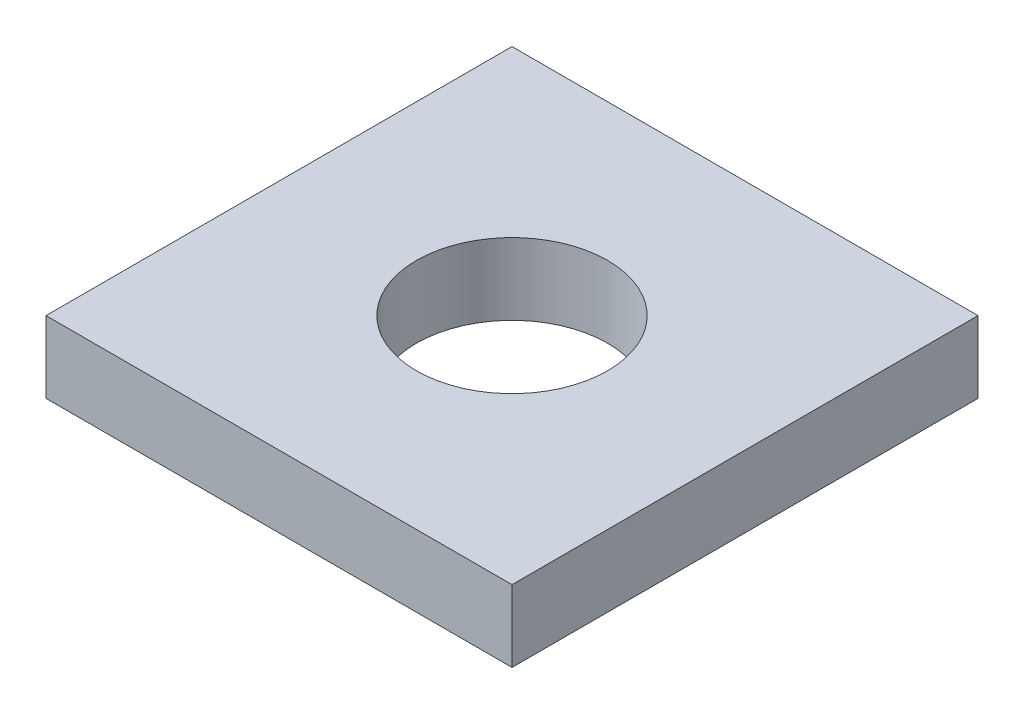
ISO-10303-21;
HEADER;
FILE_DESCRIPTION(('STEP AP214'),'2;1');
FILE_NAME('part.step','',(''),(''),'','','');
FILE_SCHEMA(('AUTOMOTIVE_DESIGN { 1 0 10303 214 1 1 1 1 }'));
ENDSEC;
DATA;
#1=APPLICATION_CONTEXT('core data for automotive mechanical design processes');
#2=APPLICATION_PROTOCOL_DEFINITION('international standard','automotive_design',2000,#1);
#3=PRODUCT_CONTEXT('',#1,'mechanical');
#4=PRODUCT('Part','Part','',(#3));
#5=PRODUCT_RELATED_PRODUCT_CATEGORY('part','',(#4));
#6=PRODUCT_DEFINITION_FORMATION('','',#4);
#7=PRODUCT_DEFINITION_CONTEXT('part definition',#1,'design');
#8=PRODUCT_DEFINITION('design','',#6,#7);
#9=PRODUCT_DEFINITION_SHAPE('','',#8);
#10=(LENGTH_UNIT() NAMED_UNIT(*) SI_UNIT(.MILLI.,.METRE.));
#11=(NAMED_UNIT(*) PLANE_ANGLE_UNIT() SI_UNIT($,.RADIAN.));
#12=(NAMED_UNIT(*) SI_UNIT($,.STERADIAN.) SOLID_ANGLE_UNIT());
#13=UNCERTAINTY_MEASURE_WITH_UNIT(LENGTH_MEASURE(1.E-05),#10,'distance_accuracy_value','');
#14=(GEOMETRIC_REPRESENTATION_CONTEXT(3) GLOBAL_UNCERTAINTY_ASSIGNED_CONTEXT((#13)) GLOBAL_UNIT_ASSIGNED_CONTEXT((#10,
#11,#12)) REPRESENTATION_CONTEXT('',''));
#15=CARTESIAN_POINT('',(0.,0.,0.));
#16=DIRECTION('',(0.,0.,1.));
#17=DIRECTION('',(1.,0.,0.));
#18=AXIS2_PLACEMENT_3D('',#15,#16,#17);
#19=CARTESIAN_POINT('',(0.,1.5,0.));
#20=DIRECTION('',(0.,-1.,0.));
#21=DIRECTION('',(0.,0.,-1.));
#22=AXIS2_PLACEMENT_3D('',#19,#20,#21);
#23=PLANE('',#22);
#24=DIRECTION('',(0.,0.,1.));
#25=VECTOR('',#24,1.);
#26=CARTESIAN_POINT('',(0.,1.5,0.));
#27=LINE('',#26,#25);
#28=CARTESIAN_POINT('',(0.,1.5,-9.75));
#29=VERTEX_POINT('',#28);
#30=CARTESIAN_POINT('',(0.,1.5,0.));
#31=VERTEX_POINT('',#30);
#32=EDGE_CURVE('E89',#29,#31,#27,.T.);
#33=ORIENTED_EDGE('',*,*,#32,.T.);
#34=DIRECTION('',(1.,0.,0.));
#35=VECTOR('',#34,1.);
#36=CARTESIAN_POINT('',(0.,1.5,0.));
#37=LINE('',#36,#35);
#38=CARTESIAN_POINT('',(9.75,1.5,0.));
#39=VERTEX_POINT('',#38);
#40=EDGE_CURVE('E84',#31,#39,#37,.T.);
#41=ORIENTED_EDGE('',*,*,#40,.T.);
#42=DIRECTION('',(0.,0.,-1.));
#43=VECTOR('',#42,1.);
#44=CARTESIAN_POINT('',(9.75,1.5,0.));
#45=LINE('',#44,#43);
#46=CARTESIAN_POINT('',(9.75,1.5,-9.75));
#47=VERTEX_POINT('',#46);
#48=EDGE_CURVE('E87',#39,#47,#45,.T.);
#49=ORIENTED_EDGE('',*,*,#48,.T.);
#50=DIRECTION('',(-1.,0.,0.));
#51=VECTOR('',#50,1.);
#52=CARTESIAN_POINT('',(0.,1.5,-9.75));
#53=LINE('',#52,#51);
#54=EDGE_CURVE('E54',#47,#29,#53,.T.);
#55=ORIENTED_EDGE('',*,*,#54,.T.);
#56=EDGE_LOOP('',(#33,#41,#49,#55));
#57=FACE_BOUND('',#56,.T.);
#58=CARTESIAN_POINT('',(4.875,1.5,-4.875));
#59=DIRECTION('',(0.,1.,0.));
#60=DIRECTION('',(0.,0.,1.));
#61=AXIS2_PLACEMENT_3D('',#58,#59,#60);
#62=CIRCLE('',#61,2.);
#63=CARTESIAN_POINT('',(4.875,1.5,-2.875));
#64=VERTEX_POINT('',#63);
#65=EDGE_CURVE('E104',#64,#64,#62,.T.);
#66=ORIENTED_EDGE('',*,*,#65,.F.);
#67=EDGE_LOOP('',(#66));
#68=FACE_BOUND('',#67,.T.);
#69=ADVANCED_FACE('F37',(#57,#68),#23,.F.);
#70=CARTESIAN_POINT('',(0.,0.,0.));
#71=DIRECTION('',(0.,-1.,0.));
#72=DIRECTION('',(0.,0.,-1.));
#73=AXIS2_PLACEMENT_3D('',#70,#71,#72);
#74=PLANE('',#73);
#75=DIRECTION('',(0.,0.,1.));
#76=VECTOR('',#75,1.);
#77=CARTESIAN_POINT('',(0.,0.,0.));
#78=LINE('',#77,#76);
#79=CARTESIAN_POINT('',(0.,0.,-9.75));
#80=VERTEX_POINT('',#79);
#81=CARTESIAN_POINT('',(0.,0.,0.));
#82=VERTEX_POINT('',#81);
#83=EDGE_CURVE('E101',#80,#82,#78,.T.);
#84=ORIENTED_EDGE('',*,*,#83,.F.);
#85=DIRECTION('',(-1.,0.,0.));
#86=VECTOR('',#85,1.);
#87=CARTESIAN_POINT('',(0.,0.,-9.75));
#88=LINE('',#87,#86);
#89=CARTESIAN_POINT('',(9.75,0.,-9.75));
#90=VERTEX_POINT('',#89);
#91=EDGE_CURVE('E77',#90,#80,#88,.T.);
#92=ORIENTED_EDGE('',*,*,#91,.F.);
#93=DIRECTION('',(0.,0.,-1.));
#94=VECTOR('',#93,1.);
#95=CARTESIAN_POINT('',(9.75,0.,0.));
#96=LINE('',#95,#94);
#97=CARTESIAN_POINT('',(9.75,0.,0.));
#98=VERTEX_POINT('',#97);
#99=EDGE_CURVE('E71',#98,#90,#96,.T.);
#100=ORIENTED_EDGE('',*,*,#99,.F.);
#101=DIRECTION('',(1.,0.,0.));
#102=VECTOR('',#101,1.);
#103=CARTESIAN_POINT('',(0.,0.,0.));
#104=LINE('',#103,#102);
#105=EDGE_CURVE('E93',#82,#98,#104,.T.);
#106=ORIENTED_EDGE('',*,*,#105,.F.);
#107=EDGE_LOOP('',(#84,#92,#100,#106));
#108=FACE_BOUND('',#107,.T.);
#109=CARTESIAN_POINT('',(4.875,0.,-4.875));
#110=DIRECTION('',(0.,1.,0.));
#111=DIRECTION('',(0.,0.,1.));
#112=AXIS2_PLACEMENT_3D('',#109,#110,#111);
#113=CIRCLE('',#112,2.);
#114=CARTESIAN_POINT('',(4.875,0.,-2.875));
#115=VERTEX_POINT('',#114);
#116=EDGE_CURVE('E116',#115,#115,#113,.T.);
#117=ORIENTED_EDGE('',*,*,#116,.T.);
#118=EDGE_LOOP('',(#117));
#119=FACE_BOUND('',#118,.T.);
#120=ADVANCED_FACE('F112',(#108,#119),#74,.T.);
#121=CARTESIAN_POINT('',(0.,1.5,0.));
#122=DIRECTION('',(1.,0.,0.));
#123=DIRECTION('',(0.,0.,-1.));
#124=AXIS2_PLACEMENT_3D('',#121,#122,#123);
#125=PLANE('',#124);
#126=ORIENTED_EDGE('',*,*,#83,.T.);
#127=DIRECTION('',(0.,-1.,0.));
#128=VECTOR('',#127,1.);
#129=CARTESIAN_POINT('',(0.,1.5,0.));
#130=LINE('',#129,#128);
#131=EDGE_CURVE('E11',#31,#82,#130,.T.);
#132=ORIENTED_EDGE('',*,*,#131,.F.);
#133=ORIENTED_EDGE('',*,*,#32,.F.);
#134=DIRECTION('',(0.,-1.,0.));
#135=VECTOR('',#134,1.);
#136=CARTESIAN_POINT('',(0.,1.5,-9.75));
#137=LINE('',#136,#135);
#138=EDGE_CURVE('E97',#29,#80,#137,.T.);
#139=ORIENTED_EDGE('',*,*,#138,.T.);
#140=EDGE_LOOP('',(#126,#132,#133,#139));
#141=FACE_BOUND('',#140,.T.);
#142=ADVANCED_FACE('F39',(#141),#125,.F.);
#143=CARTESIAN_POINT('',(0.,1.5,0.));
#144=DIRECTION('',(0.,0.,-1.));
#145=DIRECTION('',(-1.,0.,0.));
#146=AXIS2_PLACEMENT_3D('',#143,#144,#145);
#147=PLANE('',#146);
#148=ORIENTED_EDGE('',*,*,#105,.T.);
#149=DIRECTION('',(0.,-1.,0.));
#150=VECTOR('',#149,1.);
#151=CARTESIAN_POINT('',(9.75,1.5,0.));
#152=LINE('',#151,#150);
#153=EDGE_CURVE('E46',#39,#98,#152,.T.);
#154=ORIENTED_EDGE('',*,*,#153,.F.);
#155=ORIENTED_EDGE('',*,*,#40,.F.);
#156=ORIENTED_EDGE('',*,*,#131,.T.);
#157=EDGE_LOOP('',(#148,#154,#155,#156));
#158=FACE_BOUND('',#157,.T.);
#159=ADVANCED_FACE('F92',(#158),#147,.F.);
#160=CARTESIAN_POINT('',(9.75,1.5,0.));
#161=DIRECTION('',(-1.,0.,0.));
#162=DIRECTION('',(0.,0.,1.));
#163=AXIS2_PLACEMENT_3D('',#160,#161,#162);
#164=PLANE('',#163);
#165=ORIENTED_EDGE('',*,*,#99,.T.);
#166=DIRECTION('',(0.,-1.,0.));
#167=VECTOR('',#166,1.);
#168=CARTESIAN_POINT('',(9.75,1.5,-9.75));
#169=LINE('',#168,#167);
#170=EDGE_CURVE('E94',#47,#90,#169,.T.);
#171=ORIENTED_EDGE('',*,*,#170,.F.);
#172=ORIENTED_EDGE('',*,*,#48,.F.);
#173=ORIENTED_EDGE('',*,*,#153,.T.);
#174=EDGE_LOOP('',(#165,#171,#172,#173));
#175=FACE_BOUND('',#174,.T.);
#176=ADVANCED_FACE('F95',(#175),#164,.F.);
#177=CARTESIAN_POINT('',(0.,1.5,-9.75));
#178=DIRECTION('',(0.,0.,1.));
#179=DIRECTION('',(1.,0.,0.));
#180=AXIS2_PLACEMENT_3D('',#177,#178,#179);
#181=PLANE('',#180);
#182=ORIENTED_EDGE('',*,*,#91,.T.);
#183=ORIENTED_EDGE('',*,*,#138,.F.);
#184=ORIENTED_EDGE('',*,*,#54,.F.);
#185=ORIENTED_EDGE('',*,*,#170,.T.);
#186=EDGE_LOOP('',(#182,#183,#184,#185));
#187=FACE_BOUND('',#186,.T.);
#188=ADVANCED_FACE('F109',(#187),#181,.F.);
#189=CARTESIAN_POINT('',(4.875,1.5,-4.875));
#190=DIRECTION('',(0.,-1.,0.));
#191=DIRECTION('',(0.,0.,-1.));
#192=AXIS2_PLACEMENT_3D('',#189,#190,#191);
#193=CYLINDRICAL_SURFACE('',#192,2.);
#194=ORIENTED_EDGE('',*,*,#65,.T.);
#195=EDGE_LOOP('',(#194));
#196=FACE_BOUND('',#195,.T.);
#197=ORIENTED_EDGE('',*,*,#116,.F.);
#198=EDGE_LOOP('',(#197));
#199=FACE_BOUND('',#198,.T.);
#200=ADVANCED_FACE('F122',(#196,#199),#193,.F.);
#201=CLOSED_SHELL('',(#69,#120,#142,#159,#176,#188,#200));
#202=MANIFOLD_SOLID_BREP('B2',#201);
#203=ADVANCED_BREP_SHAPE_REPRESENTATION('',(#18,#202),#14);
#204=SHAPE_DEFINITION_REPRESENTATION(#9,#203);
ENDSEC;
END-ISO-10303-21;
